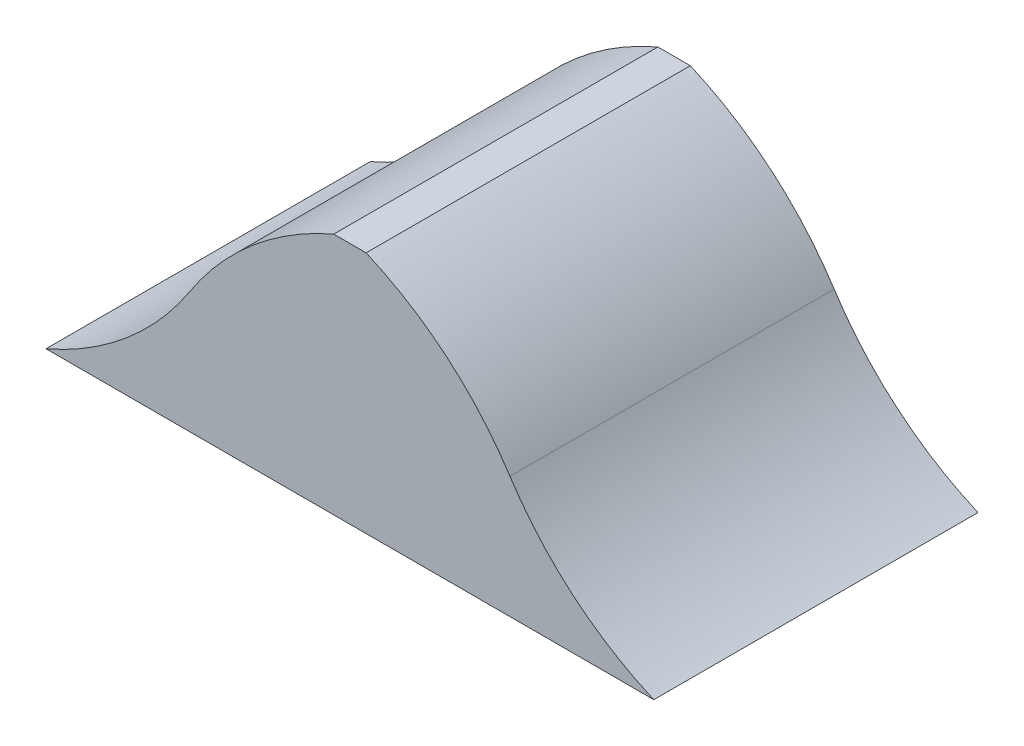
ISO-10303-21;
HEADER;
FILE_DESCRIPTION(('STEP AP214'),'2;1');
FILE_NAME('part.step','',(''),(''),'','','');
FILE_SCHEMA(('AUTOMOTIVE_DESIGN { 1 0 10303 214 1 1 1 1 }'));
ENDSEC;
DATA;
#1=APPLICATION_CONTEXT('core data for automotive mechanical design processes');
#2=APPLICATION_PROTOCOL_DEFINITION('international standard','automotive_design',2000,#1);
#3=PRODUCT_CONTEXT('',#1,'mechanical');
#4=PRODUCT('Part','Part','',(#3));
#5=PRODUCT_RELATED_PRODUCT_CATEGORY('part','',(#4));
#6=PRODUCT_DEFINITION_FORMATION('','',#4);
#7=PRODUCT_DEFINITION_CONTEXT('part definition',#1,'design');
#8=PRODUCT_DEFINITION('design','',#6,#7);
#9=PRODUCT_DEFINITION_SHAPE('','',#8);
#10=(LENGTH_UNIT() NAMED_UNIT(*) SI_UNIT(.MILLI.,.METRE.));
#11=(NAMED_UNIT(*) PLANE_ANGLE_UNIT() SI_UNIT($,.RADIAN.));
#12=(NAMED_UNIT(*) SI_UNIT($,.STERADIAN.) SOLID_ANGLE_UNIT());
#13=UNCERTAINTY_MEASURE_WITH_UNIT(LENGTH_MEASURE(1.E-05),#10,'distance_accuracy_value','');
#14=(GEOMETRIC_REPRESENTATION_CONTEXT(3) GLOBAL_UNCERTAINTY_ASSIGNED_CONTEXT((#13)) GLOBAL_UNIT_ASSIGNED_CONTEXT((#10,
#11,#12)) REPRESENTATION_CONTEXT('',''));
#15=CARTESIAN_POINT('',(0.,0.,0.));
#16=DIRECTION('',(0.,0.,1.));
#17=DIRECTION('',(1.,0.,0.));
#18=AXIS2_PLACEMENT_3D('',#15,#16,#17);
#19=CARTESIAN_POINT('',(533.300503966784,367.343096360694,400.));
#20=DIRECTION('',(0.,0.,-1.));
#21=DIRECTION('',(-1.,0.,0.));
#22=AXIS2_PLACEMENT_3D('',#19,#20,#21);
#23=CYLINDRICAL_SURFACE('',#22,400.);
#24=CARTESIAN_POINT('',(533.300503966784,367.343096360694,0.));
#25=DIRECTION('',(0.,0.,-1.));
#26=DIRECTION('',(1.,0.,0.));
#27=AXIS2_PLACEMENT_3D('',#24,#25,#26);
#28=CIRCLE('',#27,400.);
#29=CARTESIAN_POINT('',(375.,1.37772764904077E-13,0.));
#30=VERTEX_POINT('',#29);
#31=CARTESIAN_POINT('',(197.5,150.,0.));
#32=VERTEX_POINT('',#31);
#33=EDGE_CURVE('E123',#30,#32,#28,.T.);
#34=ORIENTED_EDGE('',*,*,#33,.T.);
#35=DIRECTION('',(0.,0.,-1.));
#36=VECTOR('',#35,1.);
#37=CARTESIAN_POINT('',(197.5,150.,400.));
#38=LINE('',#37,#36);
#39=CARTESIAN_POINT('',(197.5,150.,400.));
#40=VERTEX_POINT('',#39);
#41=EDGE_CURVE('E11',#40,#32,#38,.T.);
#42=ORIENTED_EDGE('',*,*,#41,.F.);
#43=CARTESIAN_POINT('',(533.300503966784,367.343096360694,400.));
#44=DIRECTION('',(0.,0.,-1.));
#45=DIRECTION('',(1.,0.,0.));
#46=AXIS2_PLACEMENT_3D('',#43,#44,#45);
#47=CIRCLE('',#46,400.);
#48=CARTESIAN_POINT('',(375.,1.37772764904077E-13,400.));
#49=VERTEX_POINT('',#48);
#50=EDGE_CURVE('E133',#49,#40,#47,.T.);
#51=ORIENTED_EDGE('',*,*,#50,.F.);
#52=DIRECTION('',(0.,0.,-1.));
#53=VECTOR('',#52,1.);
#54=CARTESIAN_POINT('',(375.,1.37772764904077E-13,400.));
#55=LINE('',#54,#53);
#56=EDGE_CURVE('E119',#49,#30,#55,.T.);
#57=ORIENTED_EDGE('',*,*,#56,.T.);
#58=EDGE_LOOP('',(#34,#42,#51,#57));
#59=FACE_BOUND('',#58,.T.);
#60=ADVANCED_FACE('F39',(#59),#23,.F.);
#61=CARTESIAN_POINT('',(-138.300503966784,-67.3430963606942,400.));
#62=DIRECTION('',(0.,0.,-1.));
#63=DIRECTION('',(-1.,0.,0.));
#64=AXIS2_PLACEMENT_3D('',#61,#62,#63);
#65=CYLINDRICAL_SURFACE('',#64,400.);
#66=CARTESIAN_POINT('',(-138.300503966784,-67.3430963606942,0.));
#67=DIRECTION('',(0.,0.,1.));
#68=DIRECTION('',(-1.,0.,0.));
#69=AXIS2_PLACEMENT_3D('',#66,#67,#68);
#70=CIRCLE('',#69,400.);
#71=CARTESIAN_POINT('',(20.,300.,0.));
#72=VERTEX_POINT('',#71);
#73=EDGE_CURVE('E126',#32,#72,#70,.T.);
#74=ORIENTED_EDGE('',*,*,#73,.T.);
#75=DIRECTION('',(0.,0.,-1.));
#76=VECTOR('',#75,1.);
#77=CARTESIAN_POINT('',(20.,300.,400.));
#78=LINE('',#77,#76);
#79=CARTESIAN_POINT('',(20.,300.,400.));
#80=VERTEX_POINT('',#79);
#81=EDGE_CURVE('E47',#80,#72,#78,.T.);
#82=ORIENTED_EDGE('',*,*,#81,.F.);
#83=CARTESIAN_POINT('',(-138.300503966784,-67.3430963606942,400.));
#84=DIRECTION('',(0.,0.,1.));
#85=DIRECTION('',(-1.,0.,0.));
#86=AXIS2_PLACEMENT_3D('',#83,#84,#85);
#87=CIRCLE('',#86,400.);
#88=EDGE_CURVE('E92',#40,#80,#87,.T.);
#89=ORIENTED_EDGE('',*,*,#88,.F.);
#90=ORIENTED_EDGE('',*,*,#41,.T.);
#91=EDGE_LOOP('',(#74,#82,#89,#90));
#92=FACE_BOUND('',#91,.T.);
#93=ADVANCED_FACE('F157',(#92),#65,.T.);
#94=CARTESIAN_POINT('',(-20.,300.,400.));
#95=DIRECTION('',(0.,-1.,0.));
#96=DIRECTION('',(0.,0.,-1.));
#97=AXIS2_PLACEMENT_3D('',#94,#95,#96);
#98=PLANE('',#97);
#99=DIRECTION('',(-1.,0.,0.));
#100=VECTOR('',#99,1.);
#101=CARTESIAN_POINT('',(-20.,300.,0.));
#102=LINE('',#101,#100);
#103=CARTESIAN_POINT('',(-20.,300.,0.));
#104=VERTEX_POINT('',#103);
#105=EDGE_CURVE('E128',#72,#104,#102,.T.);
#106=ORIENTED_EDGE('',*,*,#105,.T.);
#107=DIRECTION('',(0.,0.,-1.));
#108=VECTOR('',#107,1.);
#109=CARTESIAN_POINT('',(-20.,300.,400.));
#110=LINE('',#109,#108);
#111=CARTESIAN_POINT('',(-20.,300.,400.));
#112=VERTEX_POINT('',#111);
#113=EDGE_CURVE('E114',#112,#104,#110,.T.);
#114=ORIENTED_EDGE('',*,*,#113,.F.);
#115=DIRECTION('',(-1.,0.,0.));
#116=VECTOR('',#115,1.);
#117=CARTESIAN_POINT('',(-20.,300.,400.));
#118=LINE('',#117,#116);
#119=EDGE_CURVE('E105',#80,#112,#118,.T.);
#120=ORIENTED_EDGE('',*,*,#119,.F.);
#121=ORIENTED_EDGE('',*,*,#81,.T.);
#122=EDGE_LOOP('',(#106,#114,#120,#121));
#123=FACE_BOUND('',#122,.T.);
#124=ADVANCED_FACE('F139',(#123),#98,.F.);
#125=CARTESIAN_POINT('',(138.300503966784,-67.3430963606942,400.));
#126=DIRECTION('',(0.,0.,-1.));
#127=DIRECTION('',(-1.,0.,0.));
#128=AXIS2_PLACEMENT_3D('',#125,#126,#127);
#129=CYLINDRICAL_SURFACE('',#128,400.);
#130=CARTESIAN_POINT('',(138.300503966784,-67.3430963606942,0.));
#131=DIRECTION('',(0.,0.,1.));
#132=DIRECTION('',(-1.,0.,0.));
#133=AXIS2_PLACEMENT_3D('',#130,#131,#132);
#134=CIRCLE('',#133,400.);
#135=CARTESIAN_POINT('',(-197.5,150.,0.));
#136=VERTEX_POINT('',#135);
#137=EDGE_CURVE('E113',#104,#136,#134,.T.);
#138=ORIENTED_EDGE('',*,*,#137,.T.);
#139=DIRECTION('',(0.,0.,-1.));
#140=VECTOR('',#139,1.);
#141=CARTESIAN_POINT('',(-197.5,150.,400.));
#142=LINE('',#141,#140);
#143=CARTESIAN_POINT('',(-197.5,150.,400.));
#144=VERTEX_POINT('',#143);
#145=EDGE_CURVE('E110',#144,#136,#142,.T.);
#146=ORIENTED_EDGE('',*,*,#145,.F.);
#147=CARTESIAN_POINT('',(138.300503966784,-67.3430963606942,400.));
#148=DIRECTION('',(0.,0.,1.));
#149=DIRECTION('',(-1.,0.,0.));
#150=AXIS2_PLACEMENT_3D('',#147,#148,#149);
#151=CIRCLE('',#150,400.);
#152=EDGE_CURVE('E99',#112,#144,#151,.T.);
#153=ORIENTED_EDGE('',*,*,#152,.F.);
#154=ORIENTED_EDGE('',*,*,#113,.T.);
#155=EDGE_LOOP('',(#138,#146,#153,#154));
#156=FACE_BOUND('',#155,.T.);
#157=ADVANCED_FACE('F111',(#156),#129,.T.);
#158=CARTESIAN_POINT('',(-533.300503966784,367.343096360694,400.));
#159=DIRECTION('',(0.,0.,-1.));
#160=DIRECTION('',(-1.,0.,0.));
#161=AXIS2_PLACEMENT_3D('',#158,#159,#160);
#162=CYLINDRICAL_SURFACE('',#161,400.);
#163=CARTESIAN_POINT('',(-533.300503966784,367.343096360694,0.));
#164=DIRECTION('',(0.,0.,-1.));
#165=DIRECTION('',(1.,0.,0.));
#166=AXIS2_PLACEMENT_3D('',#163,#164,#165);
#167=CIRCLE('',#166,400.);
#168=CARTESIAN_POINT('',(-375.,0.,0.));
#169=VERTEX_POINT('',#168);
#170=EDGE_CURVE('E78',#136,#169,#167,.T.);
#171=ORIENTED_EDGE('',*,*,#170,.T.);
#172=DIRECTION('',(0.,0.,-1.));
#173=VECTOR('',#172,1.);
#174=CARTESIAN_POINT('',(-375.,0.,400.));
#175=LINE('',#174,#173);
#176=CARTESIAN_POINT('',(-375.,0.,400.));
#177=VERTEX_POINT('',#176);
#178=EDGE_CURVE('E115',#177,#169,#175,.T.);
#179=ORIENTED_EDGE('',*,*,#178,.F.);
#180=CARTESIAN_POINT('',(-533.300503966784,367.343096360694,400.));
#181=DIRECTION('',(0.,0.,-1.));
#182=DIRECTION('',(1.,0.,0.));
#183=AXIS2_PLACEMENT_3D('',#180,#181,#182);
#184=CIRCLE('',#183,400.);
#185=EDGE_CURVE('E103',#144,#177,#184,.T.);
#186=ORIENTED_EDGE('',*,*,#185,.F.);
#187=ORIENTED_EDGE('',*,*,#145,.T.);
#188=EDGE_LOOP('',(#171,#179,#186,#187));
#189=FACE_BOUND('',#188,.T.);
#190=ADVANCED_FACE('F117',(#189),#162,.F.);
#191=CARTESIAN_POINT('',(-375.,0.,400.));
#192=DIRECTION('',(0.,1.,0.));
#193=DIRECTION('',(-1.,0.,0.));
#194=AXIS2_PLACEMENT_3D('',#191,#192,#193);
#195=PLANE('',#194);
#196=DIRECTION('',(1.,0.,0.));
#197=VECTOR('',#196,1.);
#198=CARTESIAN_POINT('',(-375.,0.,0.));
#199=LINE('',#198,#197);
#200=EDGE_CURVE('E84',#169,#30,#199,.T.);
#201=ORIENTED_EDGE('',*,*,#200,.T.);
#202=ORIENTED_EDGE('',*,*,#56,.F.);
#203=DIRECTION('',(1.,0.,0.));
#204=VECTOR('',#203,1.);
#205=CARTESIAN_POINT('',(-375.,0.,400.));
#206=LINE('',#205,#204);
#207=EDGE_CURVE('E55',#177,#49,#206,.T.);
#208=ORIENTED_EDGE('',*,*,#207,.F.);
#209=ORIENTED_EDGE('',*,*,#178,.T.);
#210=EDGE_LOOP('',(#201,#202,#208,#209));
#211=FACE_BOUND('',#210,.T.);
#212=ADVANCED_FACE('F146',(#211),#195,.F.);
#213=CARTESIAN_POINT('',(533.300503966784,367.343096360694,400.));
#214=DIRECTION('',(0.,0.,1.));
#215=DIRECTION('',(1.,0.,0.));
#216=AXIS2_PLACEMENT_3D('',#213,#214,#215);
#217=PLANE('',#216);
#218=ORIENTED_EDGE('',*,*,#50,.T.);
#219=ORIENTED_EDGE('',*,*,#88,.T.);
#220=ORIENTED_EDGE('',*,*,#119,.T.);
#221=ORIENTED_EDGE('',*,*,#152,.T.);
#222=ORIENTED_EDGE('',*,*,#185,.T.);
#223=ORIENTED_EDGE('',*,*,#207,.T.);
#224=EDGE_LOOP('',(#218,#219,#220,#221,#222,#223));
#225=FACE_BOUND('',#224,.T.);
#226=ADVANCED_FACE('F101',(#225),#217,.T.);
#227=CARTESIAN_POINT('',(533.300503966784,367.343096360694,0.));
#228=DIRECTION('',(0.,0.,1.));
#229=DIRECTION('',(1.,0.,0.));
#230=AXIS2_PLACEMENT_3D('',#227,#228,#229);
#231=PLANE('',#230);
#232=ORIENTED_EDGE('',*,*,#33,.F.);
#233=ORIENTED_EDGE('',*,*,#200,.F.);
#234=ORIENTED_EDGE('',*,*,#170,.F.);
#235=ORIENTED_EDGE('',*,*,#137,.F.);
#236=ORIENTED_EDGE('',*,*,#105,.F.);
#237=ORIENTED_EDGE('',*,*,#73,.F.);
#238=EDGE_LOOP('',(#232,#233,#234,#235,#236,#237));
#239=FACE_BOUND('',#238,.T.);
#240=ADVANCED_FACE('F142',(#239),#231,.F.);
#241=CLOSED_SHELL('',(#60,#93,#124,#157,#190,#212,#226,#240));
#242=MANIFOLD_SOLID_BREP('B2',#241);
#243=ADVANCED_BREP_SHAPE_REPRESENTATION('',(#18,#242),#14);
#244=SHAPE_DEFINITION_REPRESENTATION(#9,#243);
ENDSEC;
END-ISO-10303-21;
